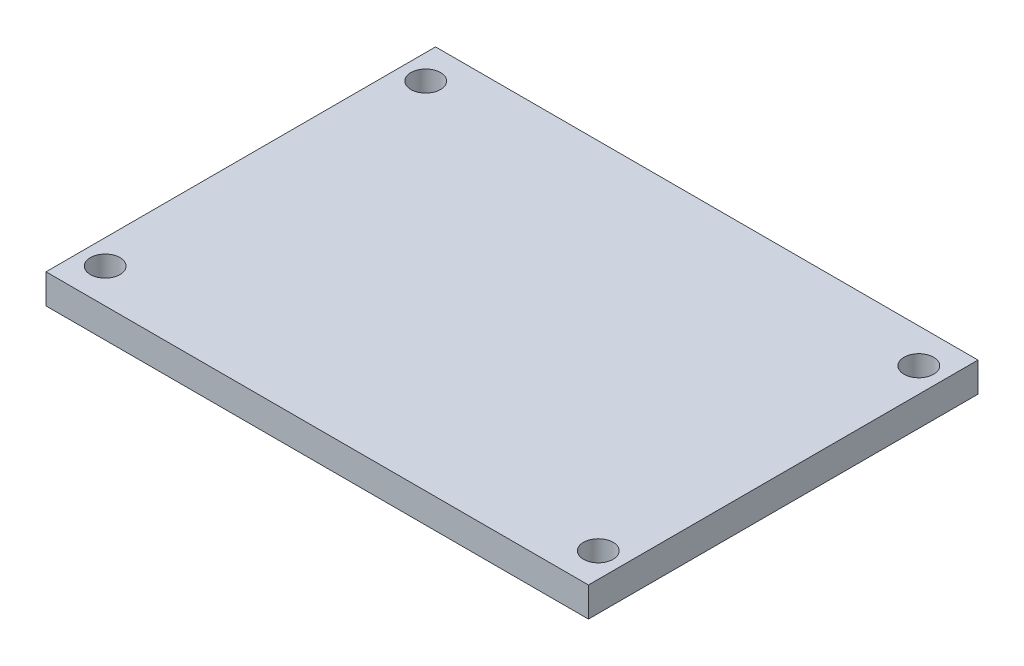
ISO-10303-21;
HEADER;
FILE_DESCRIPTION(('STEP AP214'),'2;1');
FILE_NAME('part.step','',(''),(''),'','','');
FILE_SCHEMA(('AUTOMOTIVE_DESIGN { 1 0 10303 214 1 1 1 1 }'));
ENDSEC;
DATA;
#1=APPLICATION_CONTEXT('core data for automotive mechanical design processes');
#2=APPLICATION_PROTOCOL_DEFINITION('international standard','automotive_design',2000,#1);
#3=PRODUCT_CONTEXT('',#1,'mechanical');
#4=PRODUCT('Part','Part','',(#3));
#5=PRODUCT_RELATED_PRODUCT_CATEGORY('part','',(#4));
#6=PRODUCT_DEFINITION_FORMATION('','',#4);
#7=PRODUCT_DEFINITION_CONTEXT('part definition',#1,'design');
#8=PRODUCT_DEFINITION('design','',#6,#7);
#9=PRODUCT_DEFINITION_SHAPE('','',#8);
#10=(LENGTH_UNIT() NAMED_UNIT(*) SI_UNIT(.MILLI.,.METRE.));
#11=(NAMED_UNIT(*) PLANE_ANGLE_UNIT() SI_UNIT($,.RADIAN.));
#12=(NAMED_UNIT(*) SI_UNIT($,.STERADIAN.) SOLID_ANGLE_UNIT());
#13=UNCERTAINTY_MEASURE_WITH_UNIT(LENGTH_MEASURE(1.E-05),#10,'distance_accuracy_value','');
#14=(GEOMETRIC_REPRESENTATION_CONTEXT(3) GLOBAL_UNCERTAINTY_ASSIGNED_CONTEXT((#13)) GLOBAL_UNIT_ASSIGNED_CONTEXT((#10,
#11,#12)) REPRESENTATION_CONTEXT('',''));
#15=CARTESIAN_POINT('',(0.,0.,0.));
#16=DIRECTION('',(0.,0.,1.));
#17=DIRECTION('',(1.,0.,0.));
#18=AXIS2_PLACEMENT_3D('',#15,#16,#17);
#19=CARTESIAN_POINT('',(34.925,3.81,25.0825));
#20=DIRECTION('',(-1.,0.,0.));
#21=DIRECTION('',(0.,0.,1.));
#22=AXIS2_PLACEMENT_3D('',#19,#20,#21);
#23=PLANE('',#22);
#24=DIRECTION('',(0.,0.,-1.));
#25=VECTOR('',#24,1.);
#26=CARTESIAN_POINT('',(34.925,0.,25.0825));
#27=LINE('',#26,#25);
#28=CARTESIAN_POINT('',(34.925,0.,25.0825));
#29=VERTEX_POINT('',#28);
#30=CARTESIAN_POINT('',(34.925,0.,-25.0825));
#31=VERTEX_POINT('',#30);
#32=EDGE_CURVE('E112',#29,#31,#27,.T.);
#33=ORIENTED_EDGE('',*,*,#32,.T.);
#34=DIRECTION('',(0.,-1.,0.));
#35=VECTOR('',#34,1.);
#36=CARTESIAN_POINT('',(34.925,3.81,-25.0825));
#37=LINE('',#36,#35);
#38=CARTESIAN_POINT('',(34.925,3.81,-25.0825));
#39=VERTEX_POINT('',#38);
#40=EDGE_CURVE('E11',#39,#31,#37,.T.);
#41=ORIENTED_EDGE('',*,*,#40,.F.);
#42=DIRECTION('',(0.,0.,-1.));
#43=VECTOR('',#42,1.);
#44=CARTESIAN_POINT('',(34.925,3.81,25.0825));
#45=LINE('',#44,#43);
#46=CARTESIAN_POINT('',(34.925,3.81,25.0825));
#47=VERTEX_POINT('',#46);
#48=EDGE_CURVE('E96',#47,#39,#45,.T.);
#49=ORIENTED_EDGE('',*,*,#48,.F.);
#50=DIRECTION('',(0.,-1.,0.));
#51=VECTOR('',#50,1.);
#52=CARTESIAN_POINT('',(34.925,3.81,25.0825));
#53=LINE('',#52,#51);
#54=EDGE_CURVE('E108',#47,#29,#53,.T.);
#55=ORIENTED_EDGE('',*,*,#54,.T.);
#56=EDGE_LOOP('',(#33,#41,#49,#55));
#57=FACE_BOUND('',#56,.T.);
#58=ADVANCED_FACE('F44',(#57),#23,.F.);
#59=CARTESIAN_POINT('',(-34.925,3.81,-25.0825));
#60=DIRECTION('',(0.,0.,1.));
#61=DIRECTION('',(1.,0.,0.));
#62=AXIS2_PLACEMENT_3D('',#59,#60,#61);
#63=PLANE('',#62);
#64=DIRECTION('',(-1.,0.,0.));
#65=VECTOR('',#64,1.);
#66=CARTESIAN_POINT('',(-34.925,0.,-25.0825));
#67=LINE('',#66,#65);
#68=CARTESIAN_POINT('',(-34.925,0.,-25.0825));
#69=VERTEX_POINT('',#68);
#70=EDGE_CURVE('E101',#31,#69,#67,.T.);
#71=ORIENTED_EDGE('',*,*,#70,.T.);
#72=DIRECTION('',(0.,-1.,0.));
#73=VECTOR('',#72,1.);
#74=CARTESIAN_POINT('',(-34.925,3.81,-25.0825));
#75=LINE('',#74,#73);
#76=CARTESIAN_POINT('',(-34.925,3.81,-25.0825));
#77=VERTEX_POINT('',#76);
#78=EDGE_CURVE('E53',#77,#69,#75,.T.);
#79=ORIENTED_EDGE('',*,*,#78,.F.);
#80=DIRECTION('',(-1.,0.,0.));
#81=VECTOR('',#80,1.);
#82=CARTESIAN_POINT('',(-34.925,3.81,-25.0825));
#83=LINE('',#82,#81);
#84=EDGE_CURVE('E91',#39,#77,#83,.T.);
#85=ORIENTED_EDGE('',*,*,#84,.F.);
#86=ORIENTED_EDGE('',*,*,#40,.T.);
#87=EDGE_LOOP('',(#71,#79,#85,#86));
#88=FACE_BOUND('',#87,.T.);
#89=ADVANCED_FACE('F100',(#88),#63,.F.);
#90=CARTESIAN_POINT('',(-34.925,3.81,25.0825));
#91=DIRECTION('',(1.,0.,0.));
#92=DIRECTION('',(0.,0.,-1.));
#93=AXIS2_PLACEMENT_3D('',#90,#91,#92);
#94=PLANE('',#93);
#95=DIRECTION('',(0.,0.,1.));
#96=VECTOR('',#95,1.);
#97=CARTESIAN_POINT('',(-34.925,0.,25.0825));
#98=LINE('',#97,#96);
#99=CARTESIAN_POINT('',(-34.925,0.,25.0825));
#100=VERTEX_POINT('',#99);
#101=EDGE_CURVE('E78',#69,#100,#98,.T.);
#102=ORIENTED_EDGE('',*,*,#101,.T.);
#103=DIRECTION('',(0.,-1.,0.));
#104=VECTOR('',#103,1.);
#105=CARTESIAN_POINT('',(-34.925,3.81,25.0825));
#106=LINE('',#105,#104);
#107=CARTESIAN_POINT('',(-34.925,3.81,25.0825));
#108=VERTEX_POINT('',#107);
#109=EDGE_CURVE('E103',#108,#100,#106,.T.);
#110=ORIENTED_EDGE('',*,*,#109,.F.);
#111=DIRECTION('',(0.,0.,1.));
#112=VECTOR('',#111,1.);
#113=CARTESIAN_POINT('',(-34.925,3.81,25.0825));
#114=LINE('',#113,#112);
#115=EDGE_CURVE('E94',#77,#108,#114,.T.);
#116=ORIENTED_EDGE('',*,*,#115,.F.);
#117=ORIENTED_EDGE('',*,*,#78,.T.);
#118=EDGE_LOOP('',(#102,#110,#116,#117));
#119=FACE_BOUND('',#118,.T.);
#120=ADVANCED_FACE('F104',(#119),#94,.F.);
#121=CARTESIAN_POINT('',(-34.925,3.81,25.0825));
#122=DIRECTION('',(0.,0.,-1.));
#123=DIRECTION('',(-1.,0.,0.));
#124=AXIS2_PLACEMENT_3D('',#121,#122,#123);
#125=PLANE('',#124);
#126=DIRECTION('',(1.,0.,0.));
#127=VECTOR('',#126,1.);
#128=CARTESIAN_POINT('',(-34.925,0.,25.0825));
#129=LINE('',#128,#127);
#130=EDGE_CURVE('E84',#100,#29,#129,.T.);
#131=ORIENTED_EDGE('',*,*,#130,.T.);
#132=ORIENTED_EDGE('',*,*,#54,.F.);
#133=DIRECTION('',(1.,0.,0.));
#134=VECTOR('',#133,1.);
#135=CARTESIAN_POINT('',(-34.925,3.81,25.0825));
#136=LINE('',#135,#134);
#137=EDGE_CURVE('E61',#108,#47,#136,.T.);
#138=ORIENTED_EDGE('',*,*,#137,.F.);
#139=ORIENTED_EDGE('',*,*,#109,.T.);
#140=EDGE_LOOP('',(#131,#132,#138,#139));
#141=FACE_BOUND('',#140,.T.);
#142=ADVANCED_FACE('F126',(#141),#125,.F.);
#143=CARTESIAN_POINT('',(0.,3.81,0.));
#144=DIRECTION('',(0.,-1.,0.));
#145=DIRECTION('',(0.,0.,-1.));
#146=AXIS2_PLACEMENT_3D('',#143,#144,#145);
#147=PLANE('',#146);
#148=CARTESIAN_POINT('',(-31.75,3.81,20.6375));
#149=DIRECTION('',(0.,-1.,0.));
#150=DIRECTION('',(0.,0.,-1.));
#151=AXIS2_PLACEMENT_3D('',#148,#149,#150);
#152=CIRCLE('',#151,1.905);
#153=CARTESIAN_POINT('',(-31.75,3.81,22.5425));
#154=VERTEX_POINT('',#153);
#155=EDGE_CURVE('E116',#154,#154,#152,.T.);
#156=ORIENTED_EDGE('',*,*,#155,.T.);
#157=EDGE_LOOP('',(#156));
#158=FACE_BOUND('',#157,.T.);
#159=CARTESIAN_POINT('',(31.75,3.81,20.6375));
#160=DIRECTION('',(0.,-1.,0.));
#161=DIRECTION('',(0.,0.,-1.));
#162=AXIS2_PLACEMENT_3D('',#159,#160,#161);
#163=CIRCLE('',#162,1.905);
#164=CARTESIAN_POINT('',(31.75,3.81,22.5425));
#165=VERTEX_POINT('',#164);
#166=EDGE_CURVE('E136',#165,#165,#163,.T.);
#167=ORIENTED_EDGE('',*,*,#166,.T.);
#168=EDGE_LOOP('',(#167));
#169=FACE_BOUND('',#168,.T.);
#170=CARTESIAN_POINT('',(31.75,3.81,-20.6375));
#171=DIRECTION('',(0.,-1.,0.));
#172=DIRECTION('',(0.,0.,-1.));
#173=AXIS2_PLACEMENT_3D('',#170,#171,#172);
#174=CIRCLE('',#173,1.905);
#175=CARTESIAN_POINT('',(31.75,3.81,-18.7325));
#176=VERTEX_POINT('',#175);
#177=EDGE_CURVE('E140',#176,#176,#174,.T.);
#178=ORIENTED_EDGE('',*,*,#177,.T.);
#179=EDGE_LOOP('',(#178));
#180=FACE_BOUND('',#179,.T.);
#181=CARTESIAN_POINT('',(-31.75,3.81,-20.6375));
#182=DIRECTION('',(0.,-1.,0.));
#183=DIRECTION('',(0.,0.,-1.));
#184=AXIS2_PLACEMENT_3D('',#181,#182,#183);
#185=CIRCLE('',#184,1.905);
#186=CARTESIAN_POINT('',(-31.75,3.81,-18.7325));
#187=VERTEX_POINT('',#186);
#188=EDGE_CURVE('E144',#187,#187,#185,.T.);
#189=ORIENTED_EDGE('',*,*,#188,.T.);
#190=EDGE_LOOP('',(#189));
#191=FACE_BOUND('',#190,.T.);
#192=ORIENTED_EDGE('',*,*,#48,.T.);
#193=ORIENTED_EDGE('',*,*,#84,.T.);
#194=ORIENTED_EDGE('',*,*,#115,.T.);
#195=ORIENTED_EDGE('',*,*,#137,.T.);
#196=EDGE_LOOP('',(#192,#193,#194,#195));
#197=FACE_BOUND('',#196,.T.);
#198=ADVANCED_FACE('F92',(#158,#169,#180,#191,#197),#147,.F.);
#199=CARTESIAN_POINT('',(0.,0.,0.));
#200=DIRECTION('',(0.,-1.,0.));
#201=DIRECTION('',(0.,0.,-1.));
#202=AXIS2_PLACEMENT_3D('',#199,#200,#201);
#203=PLANE('',#202);
#204=CARTESIAN_POINT('',(-31.75,0.,20.6375));
#205=DIRECTION('',(0.,1.,0.));
#206=DIRECTION('',(0.,0.,1.));
#207=AXIS2_PLACEMENT_3D('',#204,#205,#206);
#208=CIRCLE('',#207,1.905);
#209=CARTESIAN_POINT('',(-31.75,0.,22.5425));
#210=VERTEX_POINT('',#209);
#211=EDGE_CURVE('E153',#210,#210,#208,.T.);
#212=ORIENTED_EDGE('',*,*,#211,.T.);
#213=EDGE_LOOP('',(#212));
#214=FACE_BOUND('',#213,.T.);
#215=CARTESIAN_POINT('',(31.75,0.,20.6375));
#216=DIRECTION('',(0.,1.,0.));
#217=DIRECTION('',(0.,0.,1.));
#218=AXIS2_PLACEMENT_3D('',#215,#216,#217);
#219=CIRCLE('',#218,1.905);
#220=CARTESIAN_POINT('',(31.75,0.,22.5425));
#221=VERTEX_POINT('',#220);
#222=EDGE_CURVE('E157',#221,#221,#219,.T.);
#223=ORIENTED_EDGE('',*,*,#222,.T.);
#224=EDGE_LOOP('',(#223));
#225=FACE_BOUND('',#224,.T.);
#226=CARTESIAN_POINT('',(31.75,0.,-20.6375));
#227=DIRECTION('',(0.,1.,0.));
#228=DIRECTION('',(0.,0.,1.));
#229=AXIS2_PLACEMENT_3D('',#226,#227,#228);
#230=CIRCLE('',#229,1.905);
#231=CARTESIAN_POINT('',(31.75,0.,-18.7325));
#232=VERTEX_POINT('',#231);
#233=EDGE_CURVE('E152',#232,#232,#230,.T.);
#234=ORIENTED_EDGE('',*,*,#233,.T.);
#235=EDGE_LOOP('',(#234));
#236=FACE_BOUND('',#235,.T.);
#237=CARTESIAN_POINT('',(-31.75,0.,-20.6375));
#238=DIRECTION('',(0.,1.,0.));
#239=DIRECTION('',(0.,0.,1.));
#240=AXIS2_PLACEMENT_3D('',#237,#238,#239);
#241=CIRCLE('',#240,1.905);
#242=CARTESIAN_POINT('',(-31.75,0.,-18.7325));
#243=VERTEX_POINT('',#242);
#244=EDGE_CURVE('E148',#243,#243,#241,.T.);
#245=ORIENTED_EDGE('',*,*,#244,.T.);
#246=EDGE_LOOP('',(#245));
#247=FACE_BOUND('',#246,.T.);
#248=ORIENTED_EDGE('',*,*,#32,.F.);
#249=ORIENTED_EDGE('',*,*,#130,.F.);
#250=ORIENTED_EDGE('',*,*,#101,.F.);
#251=ORIENTED_EDGE('',*,*,#70,.F.);
#252=EDGE_LOOP('',(#248,#249,#250,#251));
#253=FACE_BOUND('',#252,.T.);
#254=ADVANCED_FACE('F129',(#214,#225,#236,#247,#253),#203,.T.);
#255=CARTESIAN_POINT('',(-31.75,0.,-20.6375));
#256=DIRECTION('',(0.,1.,0.));
#257=DIRECTION('',(0.,0.,1.));
#258=AXIS2_PLACEMENT_3D('',#255,#256,#257);
#259=CYLINDRICAL_SURFACE('',#258,1.905);
#260=CARTESIAN_POINT('',(-31.75,0.,-18.7325));
#261=CARTESIAN_POINT('',(-31.75,0.0396874999999999,-18.7325));
#262=CARTESIAN_POINT('',(-31.75,0.079375,-18.7325));
#263=CARTESIAN_POINT('',(-31.75,0.15875,-18.7325));
#264=CARTESIAN_POINT('',(-31.75,0.1984375,-18.7325));
#265=CARTESIAN_POINT('',(-31.75,0.2778125,-18.7325));
#266=CARTESIAN_POINT('',(-31.75,0.3175,-18.7325));
#267=CARTESIAN_POINT('',(-31.75,0.396875,-18.7325));
#268=CARTESIAN_POINT('',(-31.75,0.4365625,-18.7325));
#269=CARTESIAN_POINT('',(-31.75,0.5159375,-18.7325));
#270=CARTESIAN_POINT('',(-31.75,0.555625,-18.7325));
#271=CARTESIAN_POINT('',(-31.75,0.635,-18.7325));
#272=CARTESIAN_POINT('',(-31.75,0.6746875,-18.7325));
#273=CARTESIAN_POINT('',(-31.75,0.7540625,-18.7325));
#274=CARTESIAN_POINT('',(-31.75,0.79375,-18.7325));
#275=CARTESIAN_POINT('',(-31.75,0.873125,-18.7325));
#276=CARTESIAN_POINT('',(-31.75,0.9128125,-18.7325));
#277=CARTESIAN_POINT('',(-31.75,0.9921875,-18.7325));
#278=CARTESIAN_POINT('',(-31.75,1.031875,-18.7325));
#279=CARTESIAN_POINT('',(-31.75,1.11125,-18.7325));
#280=CARTESIAN_POINT('',(-31.75,1.1509375,-18.7325));
#281=CARTESIAN_POINT('',(-31.75,1.2303125,-18.7325));
#282=CARTESIAN_POINT('',(-31.75,1.27,-18.7325));
#283=CARTESIAN_POINT('',(-31.75,1.349375,-18.7325));
#284=CARTESIAN_POINT('',(-31.75,1.3890625,-18.7325));
#285=CARTESIAN_POINT('',(-31.75,1.4684375,-18.7325));
#286=CARTESIAN_POINT('',(-31.75,1.508125,-18.7325));
#287=CARTESIAN_POINT('',(-31.75,1.5875,-18.7325));
#288=CARTESIAN_POINT('',(-31.75,1.6271875,-18.7325));
#289=CARTESIAN_POINT('',(-31.75,1.7065625,-18.7325));
#290=CARTESIAN_POINT('',(-31.75,1.74625,-18.7325));
#291=CARTESIAN_POINT('',(-31.75,1.825625,-18.7325));
#292=CARTESIAN_POINT('',(-31.75,1.8653125,-18.7325));
#293=CARTESIAN_POINT('',(-31.75,1.9446875,-18.7325));
#294=CARTESIAN_POINT('',(-31.75,1.984375,-18.7325));
#295=CARTESIAN_POINT('',(-31.75,2.06375,-18.7325));
#296=CARTESIAN_POINT('',(-31.75,2.1034375,-18.7325));
#297=CARTESIAN_POINT('',(-31.75,2.1828125,-18.7325));
#298=CARTESIAN_POINT('',(-31.75,2.2225,-18.7325));
#299=CARTESIAN_POINT('',(-31.75,2.301875,-18.7325));
#300=CARTESIAN_POINT('',(-31.75,2.3415625,-18.7325));
#301=CARTESIAN_POINT('',(-31.75,2.4209375,-18.7325));
#302=CARTESIAN_POINT('',(-31.75,2.460625,-18.7325));
#303=CARTESIAN_POINT('',(-31.75,2.54,-18.7325));
#304=CARTESIAN_POINT('',(-31.75,2.5796875,-18.7325));
#305=CARTESIAN_POINT('',(-31.75,2.6590625,-18.7325));
#306=CARTESIAN_POINT('',(-31.75,2.69875,-18.7325));
#307=CARTESIAN_POINT('',(-31.75,2.778125,-18.7325));
#308=CARTESIAN_POINT('',(-31.75,2.8178125,-18.7325));
#309=CARTESIAN_POINT('',(-31.75,2.8971875,-18.7325));
#310=CARTESIAN_POINT('',(-31.75,2.936875,-18.7325));
#311=CARTESIAN_POINT('',(-31.75,3.01625,-18.7325));
#312=CARTESIAN_POINT('',(-31.75,3.0559375,-18.7325));
#313=CARTESIAN_POINT('',(-31.75,3.1353125,-18.7325));
#314=CARTESIAN_POINT('',(-31.75,3.175,-18.7325));
#315=CARTESIAN_POINT('',(-31.75,3.254375,-18.7325));
#316=CARTESIAN_POINT('',(-31.75,3.2940625,-18.7325));
#317=CARTESIAN_POINT('',(-31.75,3.3734375,-18.7325));
#318=CARTESIAN_POINT('',(-31.75,3.413125,-18.7325));
#319=CARTESIAN_POINT('',(-31.75,3.4925,-18.7325));
#320=CARTESIAN_POINT('',(-31.75,3.5321875,-18.7325));
#321=CARTESIAN_POINT('',(-31.75,3.6115625,-18.7325));
#322=CARTESIAN_POINT('',(-31.75,3.65125,-18.7325));
#323=CARTESIAN_POINT('',(-31.75,3.730625,-18.7325));
#324=CARTESIAN_POINT('',(-31.75,3.7703125,-18.7325));
#325=CARTESIAN_POINT('',(-31.75,3.81,-18.7325));
#326=B_SPLINE_CURVE_WITH_KNOTS('',3,(#260,#261,#262,#263,#264,#265,#266,#267,#268,#269,#270,
#271,#272,#273,#274,#275,#276,#277,#278,#279,#280,#281,#282,#283,#284,#285,#286,#287,#288,#289,
#290,#291,#292,#293,#294,#295,#296,#297,#298,#299,#300,#301,#302,#303,#304,#305,#306,#307,#308,
#309,#310,#311,#312,#313,#314,#315,#316,#317,#318,#319,#320,#321,#322,#323,#324,#325),
.UNSPECIFIED.,.F.,.F.,(4,2,2,2,2,2,2,2,2,2,2,2,2,2,2,2,2,2,2,2,2,2,2,2,2,2,2,2,2,2,2,2,4),(0.,
0.1190625,0.238125,0.3571875,0.47625,0.5953125,0.714375,0.8334375,0.9525,1.0715625,1.190625,
1.3096875,1.42875,1.5478125,1.666875,1.7859375,1.905,2.0240625,2.143125,2.2621875,2.38125,
2.5003125,2.619375,2.7384375,2.8575,2.9765625,3.095625,3.2146875,3.33375,3.4528125,3.571875,
3.6909375,3.81),.UNSPECIFIED.);
#327=EDGE_CURVE('BSEAM171',#243,#187,#326,.T.);
#328=ORIENTED_EDGE('',*,*,#244,.F.);
#329=ORIENTED_EDGE('',*,*,#188,.F.);
#330=ORIENTED_EDGE('',*,*,#327,.T.);
#331=ORIENTED_EDGE('',*,*,#327,.F.);
#332=EDGE_LOOP('',(#328,#330,#329,#331));
#333=FACE_BOUND('',#332,.T.);
#334=ADVANCED_FACE('F171',(#333),#259,.F.);
#335=CARTESIAN_POINT('',(31.75,0.,-20.6375));
#336=DIRECTION('',(0.,1.,0.));
#337=DIRECTION('',(0.,0.,1.));
#338=AXIS2_PLACEMENT_3D('',#335,#336,#337);
#339=CYLINDRICAL_SURFACE('',#338,1.905);
#340=CARTESIAN_POINT('',(31.75,0.,-18.7325));
#341=CARTESIAN_POINT('',(31.75,0.0396874999999999,-18.7325));
#342=CARTESIAN_POINT('',(31.75,0.079375,-18.7325));
#343=CARTESIAN_POINT('',(31.75,0.15875,-18.7325));
#344=CARTESIAN_POINT('',(31.75,0.1984375,-18.7325));
#345=CARTESIAN_POINT('',(31.75,0.2778125,-18.7325));
#346=CARTESIAN_POINT('',(31.75,0.3175,-18.7325));
#347=CARTESIAN_POINT('',(31.75,0.396875,-18.7325));
#348=CARTESIAN_POINT('',(31.75,0.4365625,-18.7325));
#349=CARTESIAN_POINT('',(31.75,0.5159375,-18.7325));
#350=CARTESIAN_POINT('',(31.75,0.555625,-18.7325));
#351=CARTESIAN_POINT('',(31.75,0.635,-18.7325));
#352=CARTESIAN_POINT('',(31.75,0.6746875,-18.7325));
#353=CARTESIAN_POINT('',(31.75,0.7540625,-18.7325));
#354=CARTESIAN_POINT('',(31.75,0.79375,-18.7325));
#355=CARTESIAN_POINT('',(31.75,0.873125,-18.7325));
#356=CARTESIAN_POINT('',(31.75,0.9128125,-18.7325));
#357=CARTESIAN_POINT('',(31.75,0.9921875,-18.7325));
#358=CARTESIAN_POINT('',(31.75,1.031875,-18.7325));
#359=CARTESIAN_POINT('',(31.75,1.11125,-18.7325));
#360=CARTESIAN_POINT('',(31.75,1.1509375,-18.7325));
#361=CARTESIAN_POINT('',(31.75,1.2303125,-18.7325));
#362=CARTESIAN_POINT('',(31.75,1.27,-18.7325));
#363=CARTESIAN_POINT('',(31.75,1.349375,-18.7325));
#364=CARTESIAN_POINT('',(31.75,1.3890625,-18.7325));
#365=CARTESIAN_POINT('',(31.75,1.4684375,-18.7325));
#366=CARTESIAN_POINT('',(31.75,1.508125,-18.7325));
#367=CARTESIAN_POINT('',(31.75,1.5875,-18.7325));
#368=CARTESIAN_POINT('',(31.75,1.6271875,-18.7325));
#369=CARTESIAN_POINT('',(31.75,1.7065625,-18.7325));
#370=CARTESIAN_POINT('',(31.75,1.74625,-18.7325));
#371=CARTESIAN_POINT('',(31.75,1.825625,-18.7325));
#372=CARTESIAN_POINT('',(31.75,1.8653125,-18.7325));
#373=CARTESIAN_POINT('',(31.75,1.9446875,-18.7325));
#374=CARTESIAN_POINT('',(31.75,1.984375,-18.7325));
#375=CARTESIAN_POINT('',(31.75,2.06375,-18.7325));
#376=CARTESIAN_POINT('',(31.75,2.1034375,-18.7325));
#377=CARTESIAN_POINT('',(31.75,2.1828125,-18.7325));
#378=CARTESIAN_POINT('',(31.75,2.2225,-18.7325));
#379=CARTESIAN_POINT('',(31.75,2.301875,-18.7325));
#380=CARTESIAN_POINT('',(31.75,2.3415625,-18.7325));
#381=CARTESIAN_POINT('',(31.75,2.4209375,-18.7325));
#382=CARTESIAN_POINT('',(31.75,2.460625,-18.7325));
#383=CARTESIAN_POINT('',(31.75,2.54,-18.7325));
#384=CARTESIAN_POINT('',(31.75,2.5796875,-18.7325));
#385=CARTESIAN_POINT('',(31.75,2.6590625,-18.7325));
#386=CARTESIAN_POINT('',(31.75,2.69875,-18.7325));
#387=CARTESIAN_POINT('',(31.75,2.778125,-18.7325));
#388=CARTESIAN_POINT('',(31.75,2.8178125,-18.7325));
#389=CARTESIAN_POINT('',(31.75,2.8971875,-18.7325));
#390=CARTESIAN_POINT('',(31.75,2.936875,-18.7325));
#391=CARTESIAN_POINT('',(31.75,3.01625,-18.7325));
#392=CARTESIAN_POINT('',(31.75,3.0559375,-18.7325));
#393=CARTESIAN_POINT('',(31.75,3.1353125,-18.7325));
#394=CARTESIAN_POINT('',(31.75,3.175,-18.7325));
#395=CARTESIAN_POINT('',(31.75,3.254375,-18.7325));
#396=CARTESIAN_POINT('',(31.75,3.2940625,-18.7325));
#397=CARTESIAN_POINT('',(31.75,3.3734375,-18.7325));
#398=CARTESIAN_POINT('',(31.75,3.413125,-18.7325));
#399=CARTESIAN_POINT('',(31.75,3.4925,-18.7325));
#400=CARTESIAN_POINT('',(31.75,3.5321875,-18.7325));
#401=CARTESIAN_POINT('',(31.75,3.6115625,-18.7325));
#402=CARTESIAN_POINT('',(31.75,3.65125,-18.7325));
#403=CARTESIAN_POINT('',(31.75,3.730625,-18.7325));
#404=CARTESIAN_POINT('',(31.75,3.7703125,-18.7325));
#405=CARTESIAN_POINT('',(31.75,3.81,-18.7325));
#406=B_SPLINE_CURVE_WITH_KNOTS('',3,(#340,#341,#342,#343,#344,#345,#346,#347,#348,#349,#350,
#351,#352,#353,#354,#355,#356,#357,#358,#359,#360,#361,#362,#363,#364,#365,#366,#367,#368,#369,
#370,#371,#372,#373,#374,#375,#376,#377,#378,#379,#380,#381,#382,#383,#384,#385,#386,#387,#388,
#389,#390,#391,#392,#393,#394,#395,#396,#397,#398,#399,#400,#401,#402,#403,#404,#405),
.UNSPECIFIED.,.F.,.F.,(4,2,2,2,2,2,2,2,2,2,2,2,2,2,2,2,2,2,2,2,2,2,2,2,2,2,2,2,2,2,2,2,4),(0.,
0.1190625,0.238125,0.3571875,0.47625,0.5953125,0.714375,0.8334375,0.9525,1.0715625,1.190625,
1.3096875,1.42875,1.5478125,1.666875,1.7859375,1.905,2.0240625,2.143125,2.2621875,2.38125,
2.5003125,2.619375,2.7384375,2.8575,2.9765625,3.095625,3.2146875,3.33375,3.4528125,3.571875,
3.6909375,3.81),.UNSPECIFIED.);
#407=EDGE_CURVE('BSEAM167',#232,#176,#406,.T.);
#408=ORIENTED_EDGE('',*,*,#233,.F.);
#409=ORIENTED_EDGE('',*,*,#177,.F.);
#410=ORIENTED_EDGE('',*,*,#407,.T.);
#411=ORIENTED_EDGE('',*,*,#407,.F.);
#412=EDGE_LOOP('',(#408,#410,#409,#411));
#413=FACE_BOUND('',#412,.T.);
#414=ADVANCED_FACE('F167',(#413),#339,.F.);
#415=CARTESIAN_POINT('',(31.75,0.,20.6375));
#416=DIRECTION('',(0.,1.,0.));
#417=DIRECTION('',(0.,0.,1.));
#418=AXIS2_PLACEMENT_3D('',#415,#416,#417);
#419=CYLINDRICAL_SURFACE('',#418,1.905);
#420=CARTESIAN_POINT('',(31.75,0.,22.5425));
#421=CARTESIAN_POINT('',(31.75,0.0396874999999999,22.5425));
#422=CARTESIAN_POINT('',(31.75,0.079375,22.5425));
#423=CARTESIAN_POINT('',(31.75,0.15875,22.5425));
#424=CARTESIAN_POINT('',(31.75,0.1984375,22.5425));
#425=CARTESIAN_POINT('',(31.75,0.2778125,22.5425));
#426=CARTESIAN_POINT('',(31.75,0.3175,22.5425));
#427=CARTESIAN_POINT('',(31.75,0.396875,22.5425));
#428=CARTESIAN_POINT('',(31.75,0.4365625,22.5425));
#429=CARTESIAN_POINT('',(31.75,0.5159375,22.5425));
#430=CARTESIAN_POINT('',(31.75,0.555625,22.5425));
#431=CARTESIAN_POINT('',(31.75,0.635,22.5425));
#432=CARTESIAN_POINT('',(31.75,0.6746875,22.5425));
#433=CARTESIAN_POINT('',(31.75,0.7540625,22.5425));
#434=CARTESIAN_POINT('',(31.75,0.79375,22.5425));
#435=CARTESIAN_POINT('',(31.75,0.873125,22.5425));
#436=CARTESIAN_POINT('',(31.75,0.9128125,22.5425));
#437=CARTESIAN_POINT('',(31.75,0.9921875,22.5425));
#438=CARTESIAN_POINT('',(31.75,1.031875,22.5425));
#439=CARTESIAN_POINT('',(31.75,1.11125,22.5425));
#440=CARTESIAN_POINT('',(31.75,1.1509375,22.5425));
#441=CARTESIAN_POINT('',(31.75,1.2303125,22.5425));
#442=CARTESIAN_POINT('',(31.75,1.27,22.5425));
#443=CARTESIAN_POINT('',(31.75,1.349375,22.5425));
#444=CARTESIAN_POINT('',(31.75,1.3890625,22.5425));
#445=CARTESIAN_POINT('',(31.75,1.4684375,22.5425));
#446=CARTESIAN_POINT('',(31.75,1.508125,22.5425));
#447=CARTESIAN_POINT('',(31.75,1.5875,22.5425));
#448=CARTESIAN_POINT('',(31.75,1.6271875,22.5425));
#449=CARTESIAN_POINT('',(31.75,1.7065625,22.5425));
#450=CARTESIAN_POINT('',(31.75,1.74625,22.5425));
#451=CARTESIAN_POINT('',(31.75,1.825625,22.5425));
#452=CARTESIAN_POINT('',(31.75,1.8653125,22.5425));
#453=CARTESIAN_POINT('',(31.75,1.9446875,22.5425));
#454=CARTESIAN_POINT('',(31.75,1.984375,22.5425));
#455=CARTESIAN_POINT('',(31.75,2.06375,22.5425));
#456=CARTESIAN_POINT('',(31.75,2.1034375,22.5425));
#457=CARTESIAN_POINT('',(31.75,2.1828125,22.5425));
#458=CARTESIAN_POINT('',(31.75,2.2225,22.5425));
#459=CARTESIAN_POINT('',(31.75,2.301875,22.5425));
#460=CARTESIAN_POINT('',(31.75,2.3415625,22.5425));
#461=CARTESIAN_POINT('',(31.75,2.4209375,22.5425));
#462=CARTESIAN_POINT('',(31.75,2.460625,22.5425));
#463=CARTESIAN_POINT('',(31.75,2.54,22.5425));
#464=CARTESIAN_POINT('',(31.75,2.5796875,22.5425));
#465=CARTESIAN_POINT('',(31.75,2.6590625,22.5425));
#466=CARTESIAN_POINT('',(31.75,2.69875,22.5425));
#467=CARTESIAN_POINT('',(31.75,2.778125,22.5425));
#468=CARTESIAN_POINT('',(31.75,2.8178125,22.5425));
#469=CARTESIAN_POINT('',(31.75,2.8971875,22.5425));
#470=CARTESIAN_POINT('',(31.75,2.936875,22.5425));
#471=CARTESIAN_POINT('',(31.75,3.01625,22.5425));
#472=CARTESIAN_POINT('',(31.75,3.0559375,22.5425));
#473=CARTESIAN_POINT('',(31.75,3.1353125,22.5425));
#474=CARTESIAN_POINT('',(31.75,3.175,22.5425));
#475=CARTESIAN_POINT('',(31.75,3.254375,22.5425));
#476=CARTESIAN_POINT('',(31.75,3.2940625,22.5425));
#477=CARTESIAN_POINT('',(31.75,3.3734375,22.5425));
#478=CARTESIAN_POINT('',(31.75,3.413125,22.5425));
#479=CARTESIAN_POINT('',(31.75,3.4925,22.5425));
#480=CARTESIAN_POINT('',(31.75,3.5321875,22.5425));
#481=CARTESIAN_POINT('',(31.75,3.6115625,22.5425));
#482=CARTESIAN_POINT('',(31.75,3.65125,22.5425));
#483=CARTESIAN_POINT('',(31.75,3.730625,22.5425));
#484=CARTESIAN_POINT('',(31.75,3.7703125,22.5425));
#485=CARTESIAN_POINT('',(31.75,3.81,22.5425));
#486=B_SPLINE_CURVE_WITH_KNOTS('',3,(#420,#421,#422,#423,#424,#425,#426,#427,#428,#429,#430,
#431,#432,#433,#434,#435,#436,#437,#438,#439,#440,#441,#442,#443,#444,#445,#446,#447,#448,#449,
#450,#451,#452,#453,#454,#455,#456,#457,#458,#459,#460,#461,#462,#463,#464,#465,#466,#467,#468,
#469,#470,#471,#472,#473,#474,#475,#476,#477,#478,#479,#480,#481,#482,#483,#484,#485),
.UNSPECIFIED.,.F.,.F.,(4,2,2,2,2,2,2,2,2,2,2,2,2,2,2,2,2,2,2,2,2,2,2,2,2,2,2,2,2,2,2,2,4),(0.,
0.1190625,0.238125,0.3571875,0.47625,0.5953125,0.714375,0.8334375,0.9525,1.0715625,1.190625,
1.3096875,1.42875,1.5478125,1.666875,1.7859375,1.905,2.0240625,2.143125,2.2621875,2.38125,
2.5003125,2.619375,2.7384375,2.8575,2.9765625,3.095625,3.2146875,3.33375,3.4528125,3.571875,
3.6909375,3.81),.UNSPECIFIED.);
#487=EDGE_CURVE('BSEAM170',#221,#165,#486,.T.);
#488=ORIENTED_EDGE('',*,*,#222,.F.);
#489=ORIENTED_EDGE('',*,*,#166,.F.);
#490=ORIENTED_EDGE('',*,*,#487,.T.);
#491=ORIENTED_EDGE('',*,*,#487,.F.);
#492=EDGE_LOOP('',(#488,#490,#489,#491));
#493=FACE_BOUND('',#492,.T.);
#494=ADVANCED_FACE('F170',(#493),#419,.F.);
#495=CARTESIAN_POINT('',(-31.75,0.,20.6375));
#496=DIRECTION('',(0.,1.,0.));
#497=DIRECTION('',(0.,0.,1.));
#498=AXIS2_PLACEMENT_3D('',#495,#496,#497);
#499=CYLINDRICAL_SURFACE('',#498,1.905);
#500=CARTESIAN_POINT('',(-31.75,0.,22.5425));
#501=CARTESIAN_POINT('',(-31.75,0.0396874999999999,22.5425));
#502=CARTESIAN_POINT('',(-31.75,0.079375,22.5425));
#503=CARTESIAN_POINT('',(-31.75,0.15875,22.5425));
#504=CARTESIAN_POINT('',(-31.75,0.1984375,22.5425));
#505=CARTESIAN_POINT('',(-31.75,0.2778125,22.5425));
#506=CARTESIAN_POINT('',(-31.75,0.3175,22.5425));
#507=CARTESIAN_POINT('',(-31.75,0.396875,22.5425));
#508=CARTESIAN_POINT('',(-31.75,0.4365625,22.5425));
#509=CARTESIAN_POINT('',(-31.75,0.5159375,22.5425));
#510=CARTESIAN_POINT('',(-31.75,0.555625,22.5425));
#511=CARTESIAN_POINT('',(-31.75,0.635,22.5425));
#512=CARTESIAN_POINT('',(-31.75,0.6746875,22.5425));
#513=CARTESIAN_POINT('',(-31.75,0.7540625,22.5425));
#514=CARTESIAN_POINT('',(-31.75,0.79375,22.5425));
#515=CARTESIAN_POINT('',(-31.75,0.873125,22.5425));
#516=CARTESIAN_POINT('',(-31.75,0.9128125,22.5425));
#517=CARTESIAN_POINT('',(-31.75,0.9921875,22.5425));
#518=CARTESIAN_POINT('',(-31.75,1.031875,22.5425));
#519=CARTESIAN_POINT('',(-31.75,1.11125,22.5425));
#520=CARTESIAN_POINT('',(-31.75,1.1509375,22.5425));
#521=CARTESIAN_POINT('',(-31.75,1.2303125,22.5425));
#522=CARTESIAN_POINT('',(-31.75,1.27,22.5425));
#523=CARTESIAN_POINT('',(-31.75,1.349375,22.5425));
#524=CARTESIAN_POINT('',(-31.75,1.3890625,22.5425));
#525=CARTESIAN_POINT('',(-31.75,1.4684375,22.5425));
#526=CARTESIAN_POINT('',(-31.75,1.508125,22.5425));
#527=CARTESIAN_POINT('',(-31.75,1.5875,22.5425));
#528=CARTESIAN_POINT('',(-31.75,1.6271875,22.5425));
#529=CARTESIAN_POINT('',(-31.75,1.7065625,22.5425));
#530=CARTESIAN_POINT('',(-31.75,1.74625,22.5425));
#531=CARTESIAN_POINT('',(-31.75,1.825625,22.5425));
#532=CARTESIAN_POINT('',(-31.75,1.8653125,22.5425));
#533=CARTESIAN_POINT('',(-31.75,1.9446875,22.5425));
#534=CARTESIAN_POINT('',(-31.75,1.984375,22.5425));
#535=CARTESIAN_POINT('',(-31.75,2.06375,22.5425));
#536=CARTESIAN_POINT('',(-31.75,2.1034375,22.5425));
#537=CARTESIAN_POINT('',(-31.75,2.1828125,22.5425));
#538=CARTESIAN_POINT('',(-31.75,2.2225,22.5425));
#539=CARTESIAN_POINT('',(-31.75,2.301875,22.5425));
#540=CARTESIAN_POINT('',(-31.75,2.3415625,22.5425));
#541=CARTESIAN_POINT('',(-31.75,2.4209375,22.5425));
#542=CARTESIAN_POINT('',(-31.75,2.460625,22.5425));
#543=CARTESIAN_POINT('',(-31.75,2.54,22.5425));
#544=CARTESIAN_POINT('',(-31.75,2.5796875,22.5425));
#545=CARTESIAN_POINT('',(-31.75,2.6590625,22.5425));
#546=CARTESIAN_POINT('',(-31.75,2.69875,22.5425));
#547=CARTESIAN_POINT('',(-31.75,2.778125,22.5425));
#548=CARTESIAN_POINT('',(-31.75,2.8178125,22.5425));
#549=CARTESIAN_POINT('',(-31.75,2.8971875,22.5425));
#550=CARTESIAN_POINT('',(-31.75,2.936875,22.5425));
#551=CARTESIAN_POINT('',(-31.75,3.01625,22.5425));
#552=CARTESIAN_POINT('',(-31.75,3.0559375,22.5425));
#553=CARTESIAN_POINT('',(-31.75,3.1353125,22.5425));
#554=CARTESIAN_POINT('',(-31.75,3.175,22.5425));
#555=CARTESIAN_POINT('',(-31.75,3.254375,22.5425));
#556=CARTESIAN_POINT('',(-31.75,3.2940625,22.5425));
#557=CARTESIAN_POINT('',(-31.75,3.3734375,22.5425));
#558=CARTESIAN_POINT('',(-31.75,3.413125,22.5425));
#559=CARTESIAN_POINT('',(-31.75,3.4925,22.5425));
#560=CARTESIAN_POINT('',(-31.75,3.5321875,22.5425));
#561=CARTESIAN_POINT('',(-31.75,3.6115625,22.5425));
#562=CARTESIAN_POINT('',(-31.75,3.65125,22.5425));
#563=CARTESIAN_POINT('',(-31.75,3.730625,22.5425));
#564=CARTESIAN_POINT('',(-31.75,3.7703125,22.5425));
#565=CARTESIAN_POINT('',(-31.75,3.81,22.5425));
#566=B_SPLINE_CURVE_WITH_KNOTS('',3,(#500,#501,#502,#503,#504,#505,#506,#507,#508,#509,#510,
#511,#512,#513,#514,#515,#516,#517,#518,#519,#520,#521,#522,#523,#524,#525,#526,#527,#528,#529,
#530,#531,#532,#533,#534,#535,#536,#537,#538,#539,#540,#541,#542,#543,#544,#545,#546,#547,#548,
#549,#550,#551,#552,#553,#554,#555,#556,#557,#558,#559,#560,#561,#562,#563,#564,#565),
.UNSPECIFIED.,.F.,.F.,(4,2,2,2,2,2,2,2,2,2,2,2,2,2,2,2,2,2,2,2,2,2,2,2,2,2,2,2,2,2,2,2,4),(0.,
0.1190625,0.238125,0.3571875,0.47625,0.5953125,0.714375,0.8334375,0.9525,1.0715625,1.190625,
1.3096875,1.42875,1.5478125,1.666875,1.7859375,1.905,2.0240625,2.143125,2.2621875,2.38125,
2.5003125,2.619375,2.7384375,2.8575,2.9765625,3.095625,3.2146875,3.33375,3.4528125,3.571875,
3.6909375,3.81),.UNSPECIFIED.);
#567=EDGE_CURVE('BSEAM235',#210,#154,#566,.T.);
#568=ORIENTED_EDGE('',*,*,#211,.F.);
#569=ORIENTED_EDGE('',*,*,#155,.F.);
#570=ORIENTED_EDGE('',*,*,#567,.T.);
#571=ORIENTED_EDGE('',*,*,#567,.F.);
#572=EDGE_LOOP('',(#568,#570,#569,#571));
#573=FACE_BOUND('',#572,.T.);
#574=ADVANCED_FACE('F235',(#573),#499,.F.);
#575=CLOSED_SHELL('',(#58,#89,#120,#142,#198,#254,#334,#414,#494,#574));
#576=MANIFOLD_SOLID_BREP('B2',#575);
#577=ADVANCED_BREP_SHAPE_REPRESENTATION('',(#18,#576),#14);
#578=SHAPE_DEFINITION_REPRESENTATION(#9,#577);
ENDSEC;
END-ISO-10303-21;
